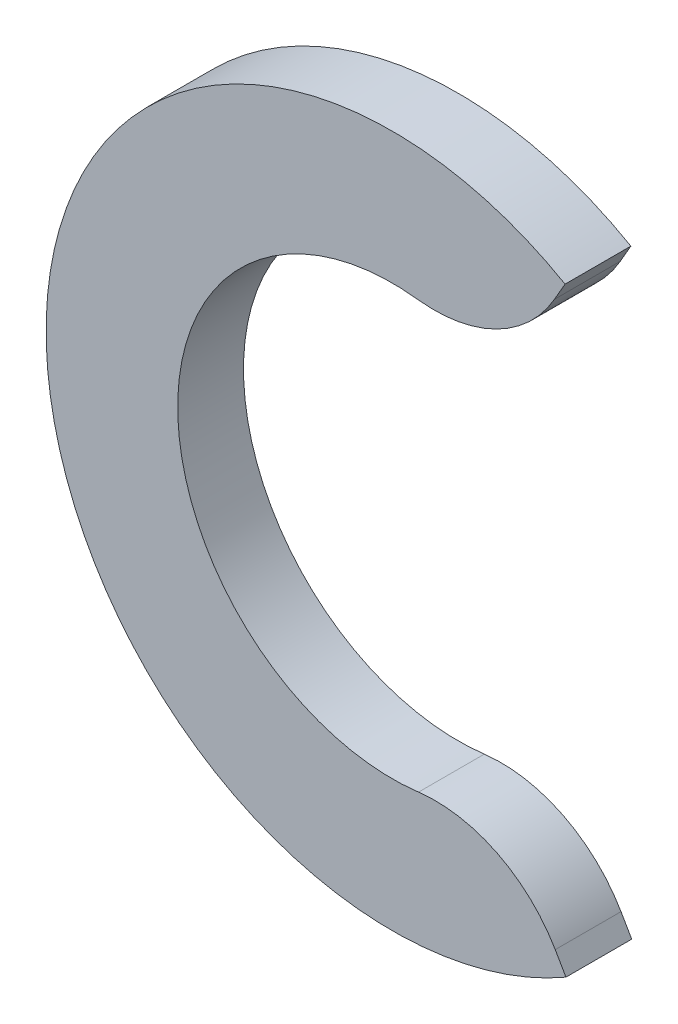
ISO-10303-21;
HEADER;
FILE_DESCRIPTION(('STEP AP214'),'2;1');
FILE_NAME('part.step','',(''),(''),'','','');
FILE_SCHEMA(('AUTOMOTIVE_DESIGN { 1 0 10303 214 1 1 1 1 }'));
ENDSEC;
DATA;
#1=APPLICATION_CONTEXT('core data for automotive mechanical design processes');
#2=APPLICATION_PROTOCOL_DEFINITION('international standard','automotive_design',2000,#1);
#3=PRODUCT_CONTEXT('',#1,'mechanical');
#4=PRODUCT('Part','Part','',(#3));
#5=PRODUCT_RELATED_PRODUCT_CATEGORY('part','',(#4));
#6=PRODUCT_DEFINITION_FORMATION('','',#4);
#7=PRODUCT_DEFINITION_CONTEXT('part definition',#1,'design');
#8=PRODUCT_DEFINITION('design','',#6,#7);
#9=PRODUCT_DEFINITION_SHAPE('','',#8);
#10=(LENGTH_UNIT() NAMED_UNIT(*) SI_UNIT(.MILLI.,.METRE.));
#11=(NAMED_UNIT(*) PLANE_ANGLE_UNIT() SI_UNIT($,.RADIAN.));
#12=(NAMED_UNIT(*) SI_UNIT($,.STERADIAN.) SOLID_ANGLE_UNIT());
#13=UNCERTAINTY_MEASURE_WITH_UNIT(LENGTH_MEASURE(1.E-05),#10,'distance_accuracy_value','');
#14=(GEOMETRIC_REPRESENTATION_CONTEXT(3) GLOBAL_UNCERTAINTY_ASSIGNED_CONTEXT((#13)) GLOBAL_UNIT_ASSIGNED_CONTEXT((#10,
#11,#12)) REPRESENTATION_CONTEXT('',''));
#15=CARTESIAN_POINT('',(0.,0.,0.));
#16=DIRECTION('',(0.,0.,1.));
#17=DIRECTION('',(1.,0.,0.));
#18=AXIS2_PLACEMENT_3D('',#15,#16,#17);
#19=CARTESIAN_POINT('',(0.,0.,0.95));
#20=DIRECTION('',(0.,0.,-1.));
#21=DIRECTION('',(-1.,0.,0.));
#22=AXIS2_PLACEMENT_3D('',#19,#20,#21);
#23=CYLINDRICAL_SURFACE('',#22,5.);
#24=CARTESIAN_POINT('',(0.,0.,0.));
#25=DIRECTION('',(0.,0.,1.));
#26=DIRECTION('',(1.,0.,0.));
#27=AXIS2_PLACEMENT_3D('',#24,#25,#26);
#28=CIRCLE('',#27,5.);
#29=CARTESIAN_POINT('',(2.49370963422305,4.33375267639757,0.));
#30=VERTEX_POINT('',#29);
#31=CARTESIAN_POINT('',(2.50628509436755,-4.32649223109796,0.));
#32=VERTEX_POINT('',#31);
#33=EDGE_CURVE('E105',#30,#32,#28,.T.);
#34=ORIENTED_EDGE('',*,*,#33,.T.);
#35=DIRECTION('',(0.,0.,-1.));
#36=VECTOR('',#35,1.);
#37=CARTESIAN_POINT('',(2.50628509436755,-4.32649223109796,0.95));
#38=LINE('',#37,#36);
#39=CARTESIAN_POINT('',(2.50628509436755,-4.32649223109796,0.95));
#40=VERTEX_POINT('',#39);
#41=EDGE_CURVE('E90',#40,#32,#38,.T.);
#42=ORIENTED_EDGE('',*,*,#41,.F.);
#43=CARTESIAN_POINT('',(0.,0.,0.95));
#44=DIRECTION('',(0.,0.,1.));
#45=DIRECTION('',(1.,0.,0.));
#46=AXIS2_PLACEMENT_3D('',#43,#44,#45);
#47=CIRCLE('',#46,5.);
#48=CARTESIAN_POINT('',(2.49370963422305,4.33375267639757,0.95));
#49=VERTEX_POINT('',#48);
#50=EDGE_CURVE('E94',#49,#40,#47,.T.);
#51=ORIENTED_EDGE('',*,*,#50,.F.);
#52=DIRECTION('',(0.,0.,-1.));
#53=VECTOR('',#52,1.);
#54=CARTESIAN_POINT('',(2.49370963422305,4.33375267639757,0.95));
#55=LINE('',#54,#53);
#56=EDGE_CURVE('E107',#49,#30,#55,.T.);
#57=ORIENTED_EDGE('',*,*,#56,.T.);
#58=EDGE_LOOP('',(#34,#42,#51,#57));
#59=FACE_BOUND('',#58,.T.);
#60=ADVANCED_FACE('F33',(#59),#23,.T.);
#61=CARTESIAN_POINT('',(1.55389675850788,-2.68242518328074,0.95));
#62=DIRECTION('',(-0.865298446219592,-0.501257018873511,0.));
#63=DIRECTION('',(0.501257018873511,-0.865298446219592,0.));
#64=AXIS2_PLACEMENT_3D('',#61,#62,#63);
#65=PLANE('',#64);
#66=DIRECTION('',(-0.501257018873511,0.865298446219593,0.));
#67=VECTOR('',#66,1.);
#68=CARTESIAN_POINT('',(1.55389675850788,-2.68242518328074,0.));
#69=LINE('',#68,#67);
#70=CARTESIAN_POINT('',(2.35163810211708,-4.05953177554643,0.));
#71=VERTEX_POINT('',#70);
#72=EDGE_CURVE('E133',#32,#71,#69,.T.);
#73=ORIENTED_EDGE('',*,*,#72,.T.);
#74=DIRECTION('',(0.,0.,-1.));
#75=VECTOR('',#74,1.);
#76=CARTESIAN_POINT('',(2.35163810211708,-4.05953177554643,0.95));
#77=LINE('',#76,#75);
#78=CARTESIAN_POINT('',(2.35163810211708,-4.05953177554643,0.95));
#79=VERTEX_POINT('',#78);
#80=EDGE_CURVE('E56',#71,#79,#77,.F.);
#81=ORIENTED_EDGE('',*,*,#80,.T.);
#82=DIRECTION('',(-0.501257018873511,0.865298446219593,0.));
#83=VECTOR('',#82,1.);
#84=CARTESIAN_POINT('',(1.55389675850788,-2.68242518328074,0.95));
#85=LINE('',#84,#83);
#86=EDGE_CURVE('E86',#40,#79,#85,.T.);
#87=ORIENTED_EDGE('',*,*,#86,.F.);
#88=ORIENTED_EDGE('',*,*,#41,.T.);
#89=EDGE_LOOP('',(#73,#81,#87,#88));
#90=FACE_BOUND('',#89,.T.);
#91=ADVANCED_FACE('F88',(#90),#65,.F.);
#92=CARTESIAN_POINT('',(0.,0.,0.95));
#93=DIRECTION('',(0.,0.,-1.));
#94=DIRECTION('',(-1.,0.,0.));
#95=AXIS2_PLACEMENT_3D('',#92,#93,#94);
#96=CYLINDRICAL_SURFACE('',#95,3.1);
#97=CARTESIAN_POINT('',(0.,0.,0.95));
#98=DIRECTION('',(0.,0.,-1.));
#99=DIRECTION('',(1.,0.,0.));
#100=AXIS2_PLACEMENT_3D('',#97,#98,#99);
#101=CIRCLE('',#100,3.1);
#102=CARTESIAN_POINT('',(0.377495637255188,-3.07692980808034,0.95));
#103=VERTEX_POINT('',#102);
#104=CARTESIAN_POINT('',(0.368558102504882,3.0780131456961,0.95));
#105=VERTEX_POINT('',#104);
#106=EDGE_CURVE('E93',#103,#105,#101,.T.);
#107=ORIENTED_EDGE('',*,*,#106,.F.);
#108=DIRECTION('',(0.,0.,-1.));
#109=VECTOR('',#108,1.);
#110=CARTESIAN_POINT('',(0.377495637255188,-3.07692980808034,0.95));
#111=LINE('',#110,#109);
#112=CARTESIAN_POINT('',(0.377495637255188,-3.07692980808034,0.));
#113=VERTEX_POINT('',#112);
#114=EDGE_CURVE('E109',#103,#113,#111,.T.);
#115=ORIENTED_EDGE('',*,*,#114,.T.);
#116=CARTESIAN_POINT('',(0.,0.,0.));
#117=DIRECTION('',(0.,0.,-1.));
#118=DIRECTION('',(1.,0.,0.));
#119=AXIS2_PLACEMENT_3D('',#116,#117,#118);
#120=CIRCLE('',#119,3.1);
#121=CARTESIAN_POINT('',(0.368558102504882,3.0780131456961,0.));
#122=VERTEX_POINT('',#121);
#123=EDGE_CURVE('E134',#113,#122,#120,.T.);
#124=ORIENTED_EDGE('',*,*,#123,.T.);
#125=DIRECTION('',(0.,0.,-1.));
#126=VECTOR('',#125,1.);
#127=CARTESIAN_POINT('',(0.368558102504882,3.0780131456961,0.95));
#128=LINE('',#127,#126);
#129=EDGE_CURVE('E106',#122,#105,#128,.F.);
#130=ORIENTED_EDGE('',*,*,#129,.T.);
#131=EDGE_LOOP('',(#107,#115,#124,#130));
#132=FACE_BOUND('',#131,.T.);
#133=ADVANCED_FACE('F125',(#132),#96,.F.);
#134=CARTESIAN_POINT('',(1.54609997321829,2.6869266593665,0.95));
#135=DIRECTION('',(-0.866750535279515,0.49874192684461,0.));
#136=DIRECTION('',(-0.49874192684461,-0.866750535279515,0.));
#137=AXIS2_PLACEMENT_3D('',#134,#135,#136);
#138=PLANE('',#137);
#139=DIRECTION('',(0.49874192684461,0.866750535279515,0.));
#140=VECTOR('',#139,1.);
#141=CARTESIAN_POINT('',(1.54609997321829,2.6869266593665,0.95));
#142=LINE('',#141,#140);
#143=CARTESIAN_POINT('',(2.3398385940348,4.06634422471404,0.95));
#144=VERTEX_POINT('',#143);
#145=EDGE_CURVE('E98',#144,#49,#142,.T.);
#146=ORIENTED_EDGE('',*,*,#145,.F.);
#147=DIRECTION('',(0.,0.,-1.));
#148=VECTOR('',#147,1.);
#149=CARTESIAN_POINT('',(2.3398385940348,4.06634422471404,0.95));
#150=LINE('',#149,#148);
#151=CARTESIAN_POINT('',(2.3398385940348,4.06634422471404,0.));
#152=VERTEX_POINT('',#151);
#153=EDGE_CURVE('E11',#144,#152,#150,.T.);
#154=ORIENTED_EDGE('',*,*,#153,.T.);
#155=DIRECTION('',(0.49874192684461,0.866750535279515,0.));
#156=VECTOR('',#155,1.);
#157=CARTESIAN_POINT('',(1.54609997321829,2.6869266593665,0.));
#158=LINE('',#157,#156);
#159=EDGE_CURVE('E102',#152,#30,#158,.T.);
#160=ORIENTED_EDGE('',*,*,#159,.T.);
#161=ORIENTED_EDGE('',*,*,#56,.F.);
#162=EDGE_LOOP('',(#146,#154,#160,#161));
#163=FACE_BOUND('',#162,.T.);
#164=ADVANCED_FACE('F141',(#163),#138,.F.);
#165=CARTESIAN_POINT('',(0.,0.,0.95));
#166=DIRECTION('',(0.,0.,1.));
#167=DIRECTION('',(1.,0.,0.));
#168=AXIS2_PLACEMENT_3D('',#165,#166,#167);
#169=PLANE('',#168);
#170=ORIENTED_EDGE('',*,*,#86,.T.);
#171=CARTESIAN_POINT('',(0.62104120967789,-5.06204581329346,0.95));
#172=DIRECTION('',(0.,0.,1.));
#173=DIRECTION('',(1.,0.,0.));
#174=AXIS2_PLACEMENT_3D('',#171,#172,#173);
#175=CIRCLE('',#174,2.);
#176=EDGE_CURVE('E41',#79,#103,#175,.T.);
#177=ORIENTED_EDGE('',*,*,#176,.T.);
#178=ORIENTED_EDGE('',*,*,#106,.T.);
#179=CARTESIAN_POINT('',(0.606337523475774,5.06382807840326,0.95));
#180=DIRECTION('',(0.,0.,1.));
#181=DIRECTION('',(1.,0.,0.));
#182=AXIS2_PLACEMENT_3D('',#179,#180,#181);
#183=CIRCLE('',#182,2.);
#184=EDGE_CURVE('E48',#105,#144,#183,.T.);
#185=ORIENTED_EDGE('',*,*,#184,.T.);
#186=ORIENTED_EDGE('',*,*,#145,.T.);
#187=ORIENTED_EDGE('',*,*,#50,.T.);
#188=EDGE_LOOP('',(#170,#177,#178,#185,#186,#187));
#189=FACE_BOUND('',#188,.T.);
#190=ADVANCED_FACE('F97',(#189),#169,.T.);
#191=CARTESIAN_POINT('',(0.,0.,0.));
#192=DIRECTION('',(0.,0.,1.));
#193=DIRECTION('',(1.,0.,0.));
#194=AXIS2_PLACEMENT_3D('',#191,#192,#193);
#195=PLANE('',#194);
#196=ORIENTED_EDGE('',*,*,#123,.F.);
#197=CARTESIAN_POINT('',(0.62104120967789,-5.06204581329346,0.));
#198=DIRECTION('',(0.,0.,1.));
#199=DIRECTION('',(1.,0.,0.));
#200=AXIS2_PLACEMENT_3D('',#197,#198,#199);
#201=CIRCLE('',#200,2.);
#202=EDGE_CURVE('E118',#113,#71,#201,.F.);
#203=ORIENTED_EDGE('',*,*,#202,.T.);
#204=ORIENTED_EDGE('',*,*,#72,.F.);
#205=ORIENTED_EDGE('',*,*,#33,.F.);
#206=ORIENTED_EDGE('',*,*,#159,.F.);
#207=CARTESIAN_POINT('',(0.606337523475774,5.06382807840326,0.));
#208=DIRECTION('',(0.,0.,1.));
#209=DIRECTION('',(1.,0.,0.));
#210=AXIS2_PLACEMENT_3D('',#207,#208,#209);
#211=CIRCLE('',#210,2.);
#212=EDGE_CURVE('E116',#152,#122,#211,.F.);
#213=ORIENTED_EDGE('',*,*,#212,.T.);
#214=EDGE_LOOP('',(#196,#203,#204,#205,#206,#213));
#215=FACE_BOUND('',#214,.T.);
#216=ADVANCED_FACE('F132',(#215),#195,.F.);
#217=CARTESIAN_POINT('',(0.62104120967789,-5.06204581329346,0.95));
#218=DIRECTION('',(0.,0.,-1.));
#219=DIRECTION('',(-1.,0.,0.));
#220=AXIS2_PLACEMENT_3D('',#217,#218,#219);
#221=CYLINDRICAL_SURFACE('',#220,2.);
#222=ORIENTED_EDGE('',*,*,#176,.F.);
#223=ORIENTED_EDGE('',*,*,#80,.F.);
#224=ORIENTED_EDGE('',*,*,#202,.F.);
#225=ORIENTED_EDGE('',*,*,#114,.F.);
#226=EDGE_LOOP('',(#222,#223,#224,#225));
#227=FACE_BOUND('',#226,.T.);
#228=ADVANCED_FACE('F130',(#227),#221,.T.);
#229=CARTESIAN_POINT('',(0.606337523475774,5.06382807840326,0.95));
#230=DIRECTION('',(0.,0.,-1.));
#231=DIRECTION('',(-1.,0.,0.));
#232=AXIS2_PLACEMENT_3D('',#229,#230,#231);
#233=CYLINDRICAL_SURFACE('',#232,2.);
#234=ORIENTED_EDGE('',*,*,#184,.F.);
#235=ORIENTED_EDGE('',*,*,#129,.F.);
#236=ORIENTED_EDGE('',*,*,#212,.F.);
#237=ORIENTED_EDGE('',*,*,#153,.F.);
#238=EDGE_LOOP('',(#234,#235,#236,#237));
#239=FACE_BOUND('',#238,.T.);
#240=ADVANCED_FACE('F35',(#239),#233,.T.);
#241=CLOSED_SHELL('',(#60,#91,#133,#164,#190,#216,#228,#240));
#242=MANIFOLD_SOLID_BREP('B2',#241);
#243=ADVANCED_BREP_SHAPE_REPRESENTATION('',(#18,#242),#14);
#244=SHAPE_DEFINITION_REPRESENTATION(#9,#243);
ENDSEC;
END-ISO-10303-21;
